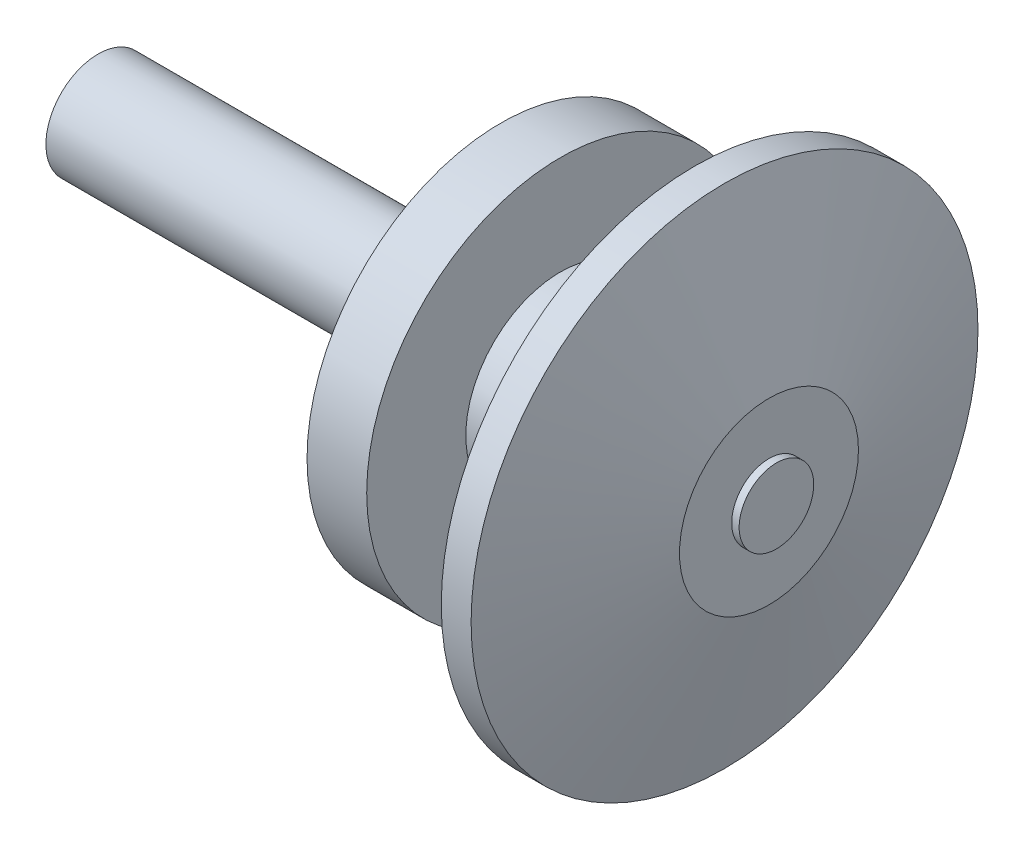
ISO-10303-21;
HEADER;
FILE_DESCRIPTION(('STEP AP214'),'2;1');
FILE_NAME('part.step','',(''),(''),'','','');
FILE_SCHEMA(('AUTOMOTIVE_DESIGN { 1 0 10303 214 1 1 1 1 }'));
ENDSEC;
DATA;
#1=APPLICATION_CONTEXT('core data for automotive mechanical design processes');
#2=APPLICATION_PROTOCOL_DEFINITION('international standard','automotive_design',2000,#1);
#3=PRODUCT_CONTEXT('',#1,'mechanical');
#4=PRODUCT('Part','Part','',(#3));
#5=PRODUCT_RELATED_PRODUCT_CATEGORY('part','',(#4));
#6=PRODUCT_DEFINITION_FORMATION('','',#4);
#7=PRODUCT_DEFINITION_CONTEXT('part definition',#1,'design');
#8=PRODUCT_DEFINITION('design','',#6,#7);
#9=PRODUCT_DEFINITION_SHAPE('','',#8);
#10=(LENGTH_UNIT() NAMED_UNIT(*) SI_UNIT(.MILLI.,.METRE.));
#11=(NAMED_UNIT(*) PLANE_ANGLE_UNIT() SI_UNIT($,.RADIAN.));
#12=(NAMED_UNIT(*) SI_UNIT($,.STERADIAN.) SOLID_ANGLE_UNIT());
#13=UNCERTAINTY_MEASURE_WITH_UNIT(LENGTH_MEASURE(1.E-05),#10,'distance_accuracy_value','');
#14=(GEOMETRIC_REPRESENTATION_CONTEXT(3) GLOBAL_UNCERTAINTY_ASSIGNED_CONTEXT((#13)) GLOBAL_UNIT_ASSIGNED_CONTEXT((#10,
#11,#12)) REPRESENTATION_CONTEXT('',''));
#15=CARTESIAN_POINT('',(0.,0.,0.));
#16=DIRECTION('',(0.,0.,1.));
#17=DIRECTION('',(1.,0.,0.));
#18=AXIS2_PLACEMENT_3D('',#15,#16,#17);
#19=CARTESIAN_POINT('',(-22.4892,0.,0.));
#20=DIRECTION('',(-1.,0.,0.));
#21=DIRECTION('',(0.,0.,1.));
#22=AXIS2_PLACEMENT_3D('',#19,#20,#21);
#23=PLANE('',#22);
#24=CARTESIAN_POINT('',(-22.4892,0.,0.));
#25=DIRECTION('',(1.,0.,0.));
#26=DIRECTION('',(0.,0.,-1.));
#27=AXIS2_PLACEMENT_3D('',#24,#25,#26);
#28=CIRCLE('',#27,1.75);
#29=CARTESIAN_POINT('',(-22.4892,0.,-1.75));
#30=VERTEX_POINT('',#29);
#31=EDGE_CURVE('E10',#30,#30,#28,.T.);
#32=ORIENTED_EDGE('',*,*,#31,.F.);
#33=EDGE_LOOP('',(#32));
#34=FACE_BOUND('',#33,.T.);
#35=ADVANCED_FACE('F32',(#34),#23,.T.);
#36=CARTESIAN_POINT('',(-22.4892,0.,0.));
#37=DIRECTION('',(1.,0.,0.));
#38=DIRECTION('',(0.,0.,-1.));
#39=AXIS2_PLACEMENT_3D('',#36,#37,#38);
#40=CYLINDRICAL_SURFACE('',#39,1.75);
#41=ORIENTED_EDGE('',*,*,#31,.T.);
#42=EDGE_LOOP('',(#41));
#43=FACE_BOUND('',#42,.T.);
#44=CARTESIAN_POINT('',(-8.9892,0.,0.));
#45=DIRECTION('',(1.,0.,0.));
#46=DIRECTION('',(0.,0.,-1.));
#47=AXIS2_PLACEMENT_3D('',#44,#45,#46);
#48=CIRCLE('',#47,1.75);
#49=CARTESIAN_POINT('',(-8.9892,0.,-1.75));
#50=VERTEX_POINT('',#49);
#51=EDGE_CURVE('E38',#50,#50,#48,.T.);
#52=ORIENTED_EDGE('',*,*,#51,.F.);
#53=EDGE_LOOP('',(#52));
#54=FACE_BOUND('',#53,.T.);
#55=ADVANCED_FACE('F89',(#43,#54),#40,.T.);
#56=CARTESIAN_POINT('',(-8.9892,1.75,0.));
#57=DIRECTION('',(-1.,0.,0.));
#58=DIRECTION('',(0.,0.,1.));
#59=AXIS2_PLACEMENT_3D('',#56,#57,#58);
#60=PLANE('',#59);
#61=ORIENTED_EDGE('',*,*,#51,.T.);
#62=EDGE_LOOP('',(#61));
#63=FACE_BOUND('',#62,.T.);
#64=CARTESIAN_POINT('',(-8.9892,0.,0.));
#65=DIRECTION('',(1.,0.,0.));
#66=DIRECTION('',(0.,0.,-1.));
#67=AXIS2_PLACEMENT_3D('',#64,#65,#66);
#68=CIRCLE('',#67,6.4963);
#69=CARTESIAN_POINT('',(-8.9892,0.,-6.4963));
#70=VERTEX_POINT('',#69);
#71=EDGE_CURVE('E42',#70,#70,#68,.T.);
#72=ORIENTED_EDGE('',*,*,#71,.F.);
#73=EDGE_LOOP('',(#72));
#74=FACE_BOUND('',#73,.T.);
#75=ADVANCED_FACE('F94',(#63,#74),#60,.T.);
#76=CARTESIAN_POINT('',(-22.4892,0.,0.));
#77=DIRECTION('',(1.,0.,0.));
#78=DIRECTION('',(0.,0.,-1.));
#79=AXIS2_PLACEMENT_3D('',#76,#77,#78);
#80=CYLINDRICAL_SURFACE('',#79,6.4963);
#81=ORIENTED_EDGE('',*,*,#71,.T.);
#82=EDGE_LOOP('',(#81));
#83=FACE_BOUND('',#82,.T.);
#84=CARTESIAN_POINT('',(-6.9892,0.,0.));
#85=DIRECTION('',(1.,0.,0.));
#86=DIRECTION('',(0.,0.,-1.));
#87=AXIS2_PLACEMENT_3D('',#84,#85,#86);
#88=CIRCLE('',#87,6.4963);
#89=CARTESIAN_POINT('',(-6.9892,0.,-6.4963));
#90=VERTEX_POINT('',#89);
#91=EDGE_CURVE('E46',#90,#90,#88,.T.);
#92=ORIENTED_EDGE('',*,*,#91,.F.);
#93=EDGE_LOOP('',(#92));
#94=FACE_BOUND('',#93,.T.);
#95=ADVANCED_FACE('F98',(#83,#94),#80,.T.);
#96=CARTESIAN_POINT('',(-6.9892,6.4963,0.));
#97=DIRECTION('',(1.,0.,0.));
#98=DIRECTION('',(0.,0.,-1.));
#99=AXIS2_PLACEMENT_3D('',#96,#97,#98);
#100=PLANE('',#99);
#101=ORIENTED_EDGE('',*,*,#91,.T.);
#102=EDGE_LOOP('',(#101));
#103=FACE_BOUND('',#102,.T.);
#104=CARTESIAN_POINT('',(-6.9892,0.,0.));
#105=DIRECTION('',(1.,0.,0.));
#106=DIRECTION('',(0.,0.,-1.));
#107=AXIS2_PLACEMENT_3D('',#104,#105,#106);
#108=CIRCLE('',#107,3.175);
#109=CARTESIAN_POINT('',(-6.9892,0.,-3.175));
#110=VERTEX_POINT('',#109);
#111=EDGE_CURVE('E51',#110,#110,#108,.T.);
#112=ORIENTED_EDGE('',*,*,#111,.F.);
#113=EDGE_LOOP('',(#112));
#114=FACE_BOUND('',#113,.T.);
#115=ADVANCED_FACE('F104',(#103,#114),#100,.T.);
#116=CARTESIAN_POINT('',(-22.4892,0.,0.));
#117=DIRECTION('',(1.,0.,0.));
#118=DIRECTION('',(0.,0.,-1.));
#119=AXIS2_PLACEMENT_3D('',#116,#117,#118);
#120=CYLINDRICAL_SURFACE('',#119,3.175);
#121=ORIENTED_EDGE('',*,*,#111,.T.);
#122=EDGE_LOOP('',(#121));
#123=FACE_BOUND('',#122,.T.);
#124=CARTESIAN_POINT('',(-2.4892,0.,0.));
#125=DIRECTION('',(1.,0.,0.));
#126=DIRECTION('',(0.,0.,-1.));
#127=AXIS2_PLACEMENT_3D('',#124,#125,#126);
#128=CIRCLE('',#127,3.175);
#129=CARTESIAN_POINT('',(-2.4892,0.,-3.175));
#130=VERTEX_POINT('',#129);
#131=EDGE_CURVE('E54',#130,#130,#128,.T.);
#132=ORIENTED_EDGE('',*,*,#131,.F.);
#133=EDGE_LOOP('',(#132));
#134=FACE_BOUND('',#133,.T.);
#135=ADVANCED_FACE('F108',(#123,#134),#120,.T.);
#136=CARTESIAN_POINT('',(-2.4892,3.175,0.));
#137=DIRECTION('',(-1.,0.,0.));
#138=DIRECTION('',(0.,0.,1.));
#139=AXIS2_PLACEMENT_3D('',#136,#137,#138);
#140=PLANE('',#139);
#141=ORIENTED_EDGE('',*,*,#131,.T.);
#142=EDGE_LOOP('',(#141));
#143=FACE_BOUND('',#142,.T.);
#144=CARTESIAN_POINT('',(-2.4892,0.,0.));
#145=DIRECTION('',(1.,0.,0.));
#146=DIRECTION('',(0.,0.,-1.));
#147=AXIS2_PLACEMENT_3D('',#144,#145,#146);
#148=CIRCLE('',#147,8.4963);
#149=CARTESIAN_POINT('',(-2.4892,0.,-8.4963));
#150=VERTEX_POINT('',#149);
#151=EDGE_CURVE('E57',#150,#150,#148,.T.);
#152=ORIENTED_EDGE('',*,*,#151,.F.);
#153=EDGE_LOOP('',(#152));
#154=FACE_BOUND('',#153,.T.);
#155=ADVANCED_FACE('F112',(#143,#154),#140,.T.);
#156=CARTESIAN_POINT('',(-22.4892,0.,0.));
#157=DIRECTION('',(1.,0.,0.));
#158=DIRECTION('',(0.,0.,-1.));
#159=AXIS2_PLACEMENT_3D('',#156,#157,#158);
#160=CYLINDRICAL_SURFACE('',#159,8.4963);
#161=ORIENTED_EDGE('',*,*,#151,.T.);
#162=EDGE_LOOP('',(#161));
#163=FACE_BOUND('',#162,.T.);
#164=CARTESIAN_POINT('',(-1.4892,0.,0.));
#165=DIRECTION('',(1.,0.,0.));
#166=DIRECTION('',(0.,0.,-1.));
#167=AXIS2_PLACEMENT_3D('',#164,#165,#166);
#168=CIRCLE('',#167,8.4963);
#169=CARTESIAN_POINT('',(-1.4892,0.,-8.4963));
#170=VERTEX_POINT('',#169);
#171=EDGE_CURVE('E60',#170,#170,#168,.T.);
#172=ORIENTED_EDGE('',*,*,#171,.F.);
#173=EDGE_LOOP('',(#172));
#174=FACE_BOUND('',#173,.T.);
#175=ADVANCED_FACE('F116',(#163,#174),#160,.T.);
#176=CARTESIAN_POINT('',(0.,0.,0.));
#177=DIRECTION('',(-1.,0.,0.));
#178=DIRECTION('',(0.,0.,1.));
#179=AXIS2_PLACEMENT_3D('',#176,#177,#178);
#180=CONICAL_SURFACE('',#179,3.,1.30620306469862);
#181=ORIENTED_EDGE('',*,*,#171,.T.);
#182=EDGE_LOOP('',(#181));
#183=FACE_BOUND('',#182,.T.);
#184=CARTESIAN_POINT('',(0.,0.,0.));
#185=DIRECTION('',(1.,0.,0.));
#186=DIRECTION('',(0.,0.,-1.));
#187=AXIS2_PLACEMENT_3D('',#184,#185,#186);
#188=CIRCLE('',#187,3.);
#189=CARTESIAN_POINT('',(0.,0.,-3.));
#190=VERTEX_POINT('',#189);
#191=EDGE_CURVE('E63',#190,#190,#188,.T.);
#192=ORIENTED_EDGE('',*,*,#191,.F.);
#193=EDGE_LOOP('',(#192));
#194=FACE_BOUND('',#193,.T.);
#195=ADVANCED_FACE('F85',(#183,#194),#180,.T.);
#196=CARTESIAN_POINT('',(0.,3.,0.));
#197=DIRECTION('',(1.,0.,0.));
#198=DIRECTION('',(0.,0.,-1.));
#199=AXIS2_PLACEMENT_3D('',#196,#197,#198);
#200=PLANE('',#199);
#201=ORIENTED_EDGE('',*,*,#191,.T.);
#202=EDGE_LOOP('',(#201));
#203=FACE_BOUND('',#202,.T.);
#204=CARTESIAN_POINT('',(0.,0.,0.));
#205=DIRECTION('',(1.,0.,0.));
#206=DIRECTION('',(0.,0.,-1.));
#207=AXIS2_PLACEMENT_3D('',#204,#205,#206);
#208=CIRCLE('',#207,1.25);
#209=CARTESIAN_POINT('',(0.,0.,-1.25));
#210=VERTEX_POINT('',#209);
#211=EDGE_CURVE('E66',#210,#210,#208,.T.);
#212=ORIENTED_EDGE('',*,*,#211,.F.);
#213=EDGE_LOOP('',(#212));
#214=FACE_BOUND('',#213,.T.);
#215=ADVANCED_FACE('F77',(#203,#214),#200,.T.);
#216=CARTESIAN_POINT('',(-22.4892,0.,0.));
#217=DIRECTION('',(1.,0.,0.));
#218=DIRECTION('',(0.,0.,-1.));
#219=AXIS2_PLACEMENT_3D('',#216,#217,#218);
#220=CYLINDRICAL_SURFACE('',#219,1.25);
#221=ORIENTED_EDGE('',*,*,#211,.T.);
#222=EDGE_LOOP('',(#221));
#223=FACE_BOUND('',#222,.T.);
#224=CARTESIAN_POINT('',(0.25,0.,0.));
#225=DIRECTION('',(1.,0.,0.));
#226=DIRECTION('',(0.,0.,-1.));
#227=AXIS2_PLACEMENT_3D('',#224,#225,#226);
#228=CIRCLE('',#227,1.25);
#229=CARTESIAN_POINT('',(0.25,0.,-1.25));
#230=VERTEX_POINT('',#229);
#231=EDGE_CURVE('E69',#230,#230,#228,.T.);
#232=ORIENTED_EDGE('',*,*,#231,.F.);
#233=EDGE_LOOP('',(#232));
#234=FACE_BOUND('',#233,.T.);
#235=ADVANCED_FACE('F75',(#223,#234),#220,.T.);
#236=CARTESIAN_POINT('',(0.25,1.25,0.));
#237=DIRECTION('',(1.,0.,0.));
#238=DIRECTION('',(0.,0.,-1.));
#239=AXIS2_PLACEMENT_3D('',#236,#237,#238);
#240=PLANE('',#239);
#241=ORIENTED_EDGE('',*,*,#231,.T.);
#242=EDGE_LOOP('',(#241));
#243=FACE_BOUND('',#242,.T.);
#244=ADVANCED_FACE('F73',(#243),#240,.T.);
#245=CLOSED_SHELL('',(#35,#55,#75,#95,#115,#135,#155,#175,#195,#215,#235,#244));
#246=MANIFOLD_SOLID_BREP('B2',#245);
#247=ADVANCED_BREP_SHAPE_REPRESENTATION('',(#18,#246),#14);
#248=SHAPE_DEFINITION_REPRESENTATION(#9,#247);
ENDSEC;
END-ISO-10303-21;
